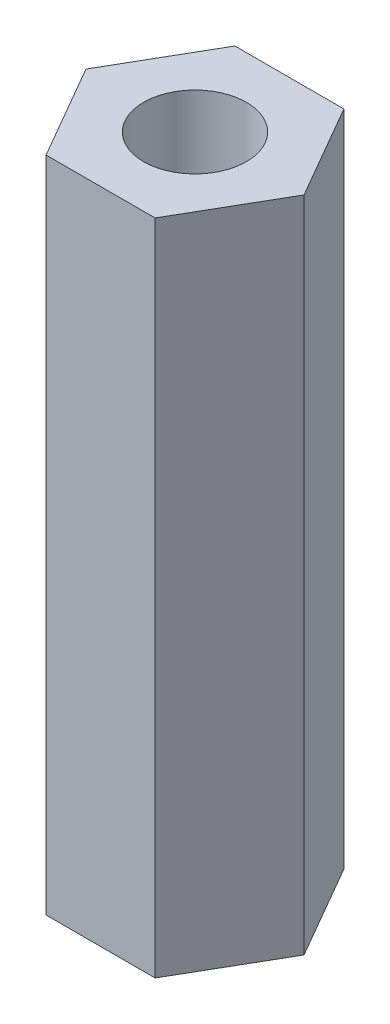
ISO-10303-21;
HEADER;
FILE_DESCRIPTION(('STEP AP214'),'2;1');
FILE_NAME('part.step','',(''),(''),'','','');
FILE_SCHEMA(('AUTOMOTIVE_DESIGN { 1 0 10303 214 1 1 1 1 }'));
ENDSEC;
DATA;
#1=APPLICATION_CONTEXT('core data for automotive mechanical design processes');
#2=APPLICATION_PROTOCOL_DEFINITION('international standard','automotive_design',2000,#1);
#3=PRODUCT_CONTEXT('',#1,'mechanical');
#4=PRODUCT('Part','Part','',(#3));
#5=PRODUCT_RELATED_PRODUCT_CATEGORY('part','',(#4));
#6=PRODUCT_DEFINITION_FORMATION('','',#4);
#7=PRODUCT_DEFINITION_CONTEXT('part definition',#1,'design');
#8=PRODUCT_DEFINITION('design','',#6,#7);
#9=PRODUCT_DEFINITION_SHAPE('','',#8);
#10=(LENGTH_UNIT() NAMED_UNIT(*) SI_UNIT(.MILLI.,.METRE.));
#11=(NAMED_UNIT(*) PLANE_ANGLE_UNIT() SI_UNIT($,.RADIAN.));
#12=(NAMED_UNIT(*) SI_UNIT($,.STERADIAN.) SOLID_ANGLE_UNIT());
#13=UNCERTAINTY_MEASURE_WITH_UNIT(LENGTH_MEASURE(1.E-05),#10,'distance_accuracy_value','');
#14=(GEOMETRIC_REPRESENTATION_CONTEXT(3) GLOBAL_UNCERTAINTY_ASSIGNED_CONTEXT((#13)) GLOBAL_UNIT_ASSIGNED_CONTEXT((#10,
#11,#12)) REPRESENTATION_CONTEXT('',''));
#15=CARTESIAN_POINT('',(0.,0.,0.));
#16=DIRECTION('',(0.,0.,1.));
#17=DIRECTION('',(1.,0.,0.));
#18=AXIS2_PLACEMENT_3D('',#15,#16,#17);
#19=CARTESIAN_POINT('',(-1.325,16.,2.29496732002876));
#20=DIRECTION('',(0.,0.,-1.));
#21=DIRECTION('',(-1.,0.,0.));
#22=AXIS2_PLACEMENT_3D('',#19,#20,#21);
#23=PLANE('',#22);
#24=DIRECTION('',(1.,0.,0.));
#25=VECTOR('',#24,1.);
#26=CARTESIAN_POINT('',(-1.325,0.,2.29496732002876));
#27=LINE('',#26,#25);
#28=CARTESIAN_POINT('',(-1.325,0.,2.29496732002876));
#29=VERTEX_POINT('',#28);
#30=CARTESIAN_POINT('',(1.325,0.,2.29496732002876));
#31=VERTEX_POINT('',#30);
#32=EDGE_CURVE('E121',#29,#31,#27,.T.);
#33=ORIENTED_EDGE('',*,*,#32,.T.);
#34=DIRECTION('',(0.,-1.,0.));
#35=VECTOR('',#34,1.);
#36=CARTESIAN_POINT('',(1.325,16.,2.29496732002876));
#37=LINE('',#36,#35);
#38=CARTESIAN_POINT('',(1.325,16.,2.29496732002876));
#39=VERTEX_POINT('',#38);
#40=EDGE_CURVE('E11',#39,#31,#37,.T.);
#41=ORIENTED_EDGE('',*,*,#40,.F.);
#42=DIRECTION('',(1.,0.,0.));
#43=VECTOR('',#42,1.);
#44=CARTESIAN_POINT('',(-1.325,16.,2.29496732002876));
#45=LINE('',#44,#43);
#46=CARTESIAN_POINT('',(-1.325,16.,2.29496732002876));
#47=VERTEX_POINT('',#46);
#48=EDGE_CURVE('E131',#47,#39,#45,.T.);
#49=ORIENTED_EDGE('',*,*,#48,.F.);
#50=DIRECTION('',(0.,-1.,0.));
#51=VECTOR('',#50,1.);
#52=CARTESIAN_POINT('',(-1.325,16.,2.29496732002876));
#53=LINE('',#52,#51);
#54=EDGE_CURVE('E117',#47,#29,#53,.T.);
#55=ORIENTED_EDGE('',*,*,#54,.T.);
#56=EDGE_LOOP('',(#33,#41,#49,#55));
#57=FACE_BOUND('',#56,.T.);
#58=ADVANCED_FACE('F36',(#57),#23,.F.);
#59=CARTESIAN_POINT('',(1.325,16.,2.29496732002876));
#60=DIRECTION('',(-0.866025403784439,0.,-0.5));
#61=DIRECTION('',(-0.5,0.,0.866025403784439));
#62=AXIS2_PLACEMENT_3D('',#59,#60,#61);
#63=PLANE('',#62);
#64=DIRECTION('',(0.5,0.,-0.866025403784439));
#65=VECTOR('',#64,1.);
#66=CARTESIAN_POINT('',(1.325,0.,2.29496732002876));
#67=LINE('',#66,#65);
#68=CARTESIAN_POINT('',(2.65,0.,0.));
#69=VERTEX_POINT('',#68);
#70=EDGE_CURVE('E124',#31,#69,#67,.T.);
#71=ORIENTED_EDGE('',*,*,#70,.T.);
#72=DIRECTION('',(0.,-1.,0.));
#73=VECTOR('',#72,1.);
#74=CARTESIAN_POINT('',(2.65,16.,0.));
#75=LINE('',#74,#73);
#76=CARTESIAN_POINT('',(2.65,16.,0.));
#77=VERTEX_POINT('',#76);
#78=EDGE_CURVE('E45',#77,#69,#75,.T.);
#79=ORIENTED_EDGE('',*,*,#78,.F.);
#80=DIRECTION('',(0.5,0.,-0.866025403784439));
#81=VECTOR('',#80,1.);
#82=CARTESIAN_POINT('',(1.325,16.,2.29496732002876));
#83=LINE('',#82,#81);
#84=EDGE_CURVE('E90',#39,#77,#83,.T.);
#85=ORIENTED_EDGE('',*,*,#84,.F.);
#86=ORIENTED_EDGE('',*,*,#40,.T.);
#87=EDGE_LOOP('',(#71,#79,#85,#86));
#88=FACE_BOUND('',#87,.T.);
#89=ADVANCED_FACE('F157',(#88),#63,.F.);
#90=CARTESIAN_POINT('',(2.65,16.,0.));
#91=DIRECTION('',(-0.866025403784439,0.,0.5));
#92=DIRECTION('',(0.5,0.,0.866025403784439));
#93=AXIS2_PLACEMENT_3D('',#90,#91,#92);
#94=PLANE('',#93);
#95=DIRECTION('',(-0.5,0.,-0.866025403784439));
#96=VECTOR('',#95,1.);
#97=CARTESIAN_POINT('',(2.65,0.,0.));
#98=LINE('',#97,#96);
#99=CARTESIAN_POINT('',(1.325,0.,-2.29496732002876));
#100=VERTEX_POINT('',#99);
#101=EDGE_CURVE('E126',#69,#100,#98,.T.);
#102=ORIENTED_EDGE('',*,*,#101,.T.);
#103=DIRECTION('',(0.,-1.,0.));
#104=VECTOR('',#103,1.);
#105=CARTESIAN_POINT('',(1.325,16.,-2.29496732002876));
#106=LINE('',#105,#104);
#107=CARTESIAN_POINT('',(1.325,16.,-2.29496732002876));
#108=VERTEX_POINT('',#107);
#109=EDGE_CURVE('E112',#108,#100,#106,.T.);
#110=ORIENTED_EDGE('',*,*,#109,.F.);
#111=DIRECTION('',(-0.5,0.,-0.866025403784439));
#112=VECTOR('',#111,1.);
#113=CARTESIAN_POINT('',(2.65,16.,0.));
#114=LINE('',#113,#112);
#115=EDGE_CURVE('E103',#77,#108,#114,.T.);
#116=ORIENTED_EDGE('',*,*,#115,.F.);
#117=ORIENTED_EDGE('',*,*,#78,.T.);
#118=EDGE_LOOP('',(#102,#110,#116,#117));
#119=FACE_BOUND('',#118,.T.);
#120=ADVANCED_FACE('F138',(#119),#94,.F.);
#121=CARTESIAN_POINT('',(1.325,16.,-2.29496732002876));
#122=DIRECTION('',(0.,0.,1.));
#123=DIRECTION('',(1.,0.,0.));
#124=AXIS2_PLACEMENT_3D('',#121,#122,#123);
#125=PLANE('',#124);
#126=DIRECTION('',(-1.,0.,0.));
#127=VECTOR('',#126,1.);
#128=CARTESIAN_POINT('',(1.325,0.,-2.29496732002876));
#129=LINE('',#128,#127);
#130=CARTESIAN_POINT('',(-1.325,0.,-2.29496732002876));
#131=VERTEX_POINT('',#130);
#132=EDGE_CURVE('E111',#100,#131,#129,.T.);
#133=ORIENTED_EDGE('',*,*,#132,.T.);
#134=DIRECTION('',(0.,-1.,0.));
#135=VECTOR('',#134,1.);
#136=CARTESIAN_POINT('',(-1.325,16.,-2.29496732002876));
#137=LINE('',#136,#135);
#138=CARTESIAN_POINT('',(-1.325,16.,-2.29496732002876));
#139=VERTEX_POINT('',#138);
#140=EDGE_CURVE('E108',#139,#131,#137,.T.);
#141=ORIENTED_EDGE('',*,*,#140,.F.);
#142=DIRECTION('',(-1.,0.,0.));
#143=VECTOR('',#142,1.);
#144=CARTESIAN_POINT('',(1.325,16.,-2.29496732002876));
#145=LINE('',#144,#143);
#146=EDGE_CURVE('E97',#108,#139,#145,.T.);
#147=ORIENTED_EDGE('',*,*,#146,.F.);
#148=ORIENTED_EDGE('',*,*,#109,.T.);
#149=EDGE_LOOP('',(#133,#141,#147,#148));
#150=FACE_BOUND('',#149,.T.);
#151=ADVANCED_FACE('F109',(#150),#125,.F.);
#152=CARTESIAN_POINT('',(-1.325,16.,-2.29496732002876));
#153=DIRECTION('',(0.866025403784439,0.,0.5));
#154=DIRECTION('',(0.5,0.,-0.866025403784439));
#155=AXIS2_PLACEMENT_3D('',#152,#153,#154);
#156=PLANE('',#155);
#157=DIRECTION('',(-0.5,0.,0.866025403784439));
#158=VECTOR('',#157,1.);
#159=CARTESIAN_POINT('',(-1.325,0.,-2.29496732002876));
#160=LINE('',#159,#158);
#161=CARTESIAN_POINT('',(-2.65,0.,0.));
#162=VERTEX_POINT('',#161);
#163=EDGE_CURVE('E76',#131,#162,#160,.T.);
#164=ORIENTED_EDGE('',*,*,#163,.T.);
#165=DIRECTION('',(0.,-1.,0.));
#166=VECTOR('',#165,1.);
#167=CARTESIAN_POINT('',(-2.65,16.,0.));
#168=LINE('',#167,#166);
#169=CARTESIAN_POINT('',(-2.65,16.,0.));
#170=VERTEX_POINT('',#169);
#171=EDGE_CURVE('E113',#170,#162,#168,.T.);
#172=ORIENTED_EDGE('',*,*,#171,.F.);
#173=DIRECTION('',(-0.5,0.,0.866025403784439));
#174=VECTOR('',#173,1.);
#175=CARTESIAN_POINT('',(-1.325,16.,-2.29496732002876));
#176=LINE('',#175,#174);
#177=EDGE_CURVE('E101',#139,#170,#176,.T.);
#178=ORIENTED_EDGE('',*,*,#177,.F.);
#179=ORIENTED_EDGE('',*,*,#140,.T.);
#180=EDGE_LOOP('',(#164,#172,#178,#179));
#181=FACE_BOUND('',#180,.T.);
#182=ADVANCED_FACE('F115',(#181),#156,.F.);
#183=CARTESIAN_POINT('',(-2.65,16.,0.));
#184=DIRECTION('',(0.866025403784439,0.,-0.5));
#185=DIRECTION('',(-0.5,0.,-0.866025403784439));
#186=AXIS2_PLACEMENT_3D('',#183,#184,#185);
#187=PLANE('',#186);
#188=DIRECTION('',(0.5,0.,0.866025403784439));
#189=VECTOR('',#188,1.);
#190=CARTESIAN_POINT('',(-2.65,0.,0.));
#191=LINE('',#190,#189);
#192=EDGE_CURVE('E82',#162,#29,#191,.T.);
#193=ORIENTED_EDGE('',*,*,#192,.T.);
#194=ORIENTED_EDGE('',*,*,#54,.F.);
#195=DIRECTION('',(0.5,0.,0.866025403784439));
#196=VECTOR('',#195,1.);
#197=CARTESIAN_POINT('',(-2.65,16.,0.));
#198=LINE('',#197,#196);
#199=EDGE_CURVE('E53',#170,#47,#198,.T.);
#200=ORIENTED_EDGE('',*,*,#199,.F.);
#201=ORIENTED_EDGE('',*,*,#171,.T.);
#202=EDGE_LOOP('',(#193,#194,#200,#201));
#203=FACE_BOUND('',#202,.T.);
#204=ADVANCED_FACE('F145',(#203),#187,.F.);
#205=CARTESIAN_POINT('',(0.,16.,0.));
#206=DIRECTION('',(0.,1.,0.));
#207=DIRECTION('',(0.,0.,1.));
#208=AXIS2_PLACEMENT_3D('',#205,#206,#207);
#209=PLANE('',#208);
#210=CARTESIAN_POINT('',(0.,16.,0.));
#211=DIRECTION('',(0.,1.,0.));
#212=DIRECTION('',(0.,0.,1.));
#213=AXIS2_PLACEMENT_3D('',#210,#211,#212);
#214=CIRCLE('',#213,1.25);
#215=CARTESIAN_POINT('',(0.,16.,1.25));
#216=VERTEX_POINT('',#215);
#217=EDGE_CURVE('E212',#216,#216,#214,.T.);
#218=ORIENTED_EDGE('',*,*,#217,.F.);
#219=EDGE_LOOP('',(#218));
#220=FACE_BOUND('',#219,.T.);
#221=ORIENTED_EDGE('',*,*,#48,.T.);
#222=ORIENTED_EDGE('',*,*,#84,.T.);
#223=ORIENTED_EDGE('',*,*,#115,.T.);
#224=ORIENTED_EDGE('',*,*,#146,.T.);
#225=ORIENTED_EDGE('',*,*,#177,.T.);
#226=ORIENTED_EDGE('',*,*,#199,.T.);
#227=EDGE_LOOP('',(#221,#222,#223,#224,#225,#226));
#228=FACE_BOUND('',#227,.T.);
#229=ADVANCED_FACE('F99',(#220,#228),#209,.T.);
#230=CARTESIAN_POINT('',(0.,0.,0.));
#231=DIRECTION('',(0.,1.,0.));
#232=DIRECTION('',(0.,0.,1.));
#233=AXIS2_PLACEMENT_3D('',#230,#231,#232);
#234=PLANE('',#233);
#235=CARTESIAN_POINT('',(0.,0.,0.));
#236=DIRECTION('',(0.,1.,0.));
#237=DIRECTION('',(0.,0.,1.));
#238=AXIS2_PLACEMENT_3D('',#235,#236,#237);
#239=CIRCLE('',#238,1.25);
#240=CARTESIAN_POINT('',(0.,0.,1.25));
#241=VERTEX_POINT('',#240);
#242=EDGE_CURVE('E39',#241,#241,#239,.T.);
#243=ORIENTED_EDGE('',*,*,#242,.T.);
#244=EDGE_LOOP('',(#243));
#245=FACE_BOUND('',#244,.T.);
#246=ORIENTED_EDGE('',*,*,#32,.F.);
#247=ORIENTED_EDGE('',*,*,#192,.F.);
#248=ORIENTED_EDGE('',*,*,#163,.F.);
#249=ORIENTED_EDGE('',*,*,#132,.F.);
#250=ORIENTED_EDGE('',*,*,#101,.F.);
#251=ORIENTED_EDGE('',*,*,#70,.F.);
#252=EDGE_LOOP('',(#246,#247,#248,#249,#250,#251));
#253=FACE_BOUND('',#252,.T.);
#254=ADVANCED_FACE('F141',(#245,#253),#234,.F.);
#255=CARTESIAN_POINT('',(0.,-24.,0.));
#256=DIRECTION('',(0.,1.,0.));
#257=DIRECTION('',(0.,0.,1.));
#258=AXIS2_PLACEMENT_3D('',#255,#256,#257);
#259=CYLINDRICAL_SURFACE('',#258,1.25);
#260=ORIENTED_EDGE('',*,*,#217,.T.);
#261=EDGE_LOOP('',(#260));
#262=FACE_BOUND('',#261,.T.);
#263=ORIENTED_EDGE('',*,*,#242,.F.);
#264=EDGE_LOOP('',(#263));
#265=FACE_BOUND('',#264,.T.);
#266=ADVANCED_FACE('F194',(#262,#265),#259,.F.);
#267=CLOSED_SHELL('',(#58,#89,#120,#151,#182,#204,#229,#254,#266));
#268=MANIFOLD_SOLID_BREP('B2',#267);
#269=ADVANCED_BREP_SHAPE_REPRESENTATION('',(#18,#268),#14);
#270=SHAPE_DEFINITION_REPRESENTATION(#9,#269);
ENDSEC;
END-ISO-10303-21;
